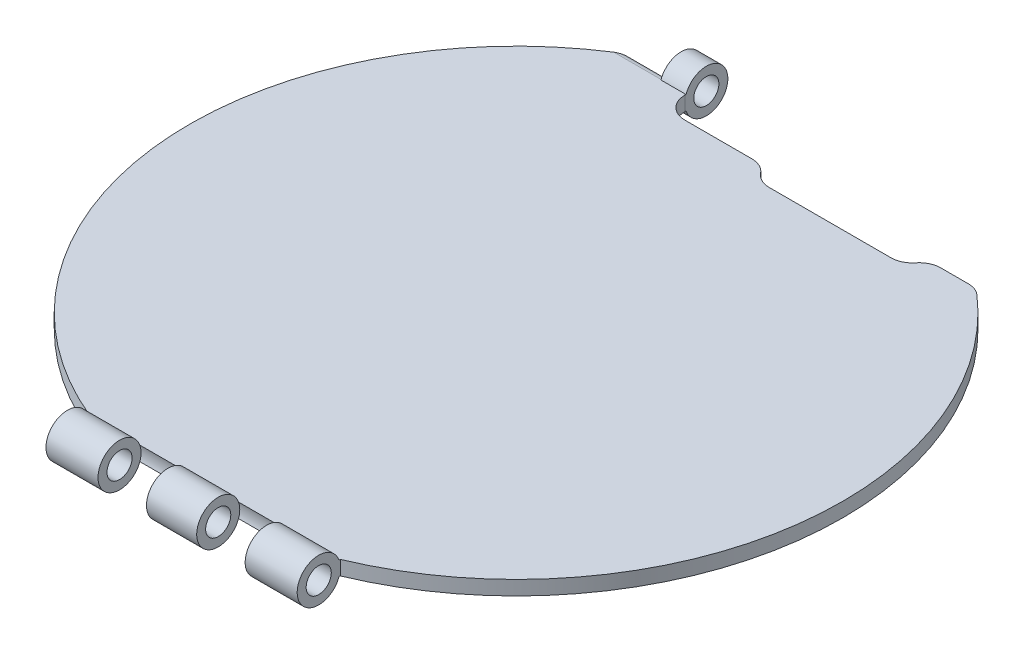
ISO-10303-21;
HEADER;
FILE_DESCRIPTION(('STEP AP214'),'2;1');
FILE_NAME('part.step','',(''),(''),'','','');
FILE_SCHEMA(('AUTOMOTIVE_DESIGN { 1 0 10303 214 1 1 1 1 }'));
ENDSEC;
DATA;
#1=APPLICATION_CONTEXT('core data for automotive mechanical design processes');
#2=APPLICATION_PROTOCOL_DEFINITION('international standard','automotive_design',2000,#1);
#3=PRODUCT_CONTEXT('',#1,'mechanical');
#4=PRODUCT('Part','Part','',(#3));
#5=PRODUCT_RELATED_PRODUCT_CATEGORY('part','',(#4));
#6=PRODUCT_DEFINITION_FORMATION('','',#4);
#7=PRODUCT_DEFINITION_CONTEXT('part definition',#1,'design');
#8=PRODUCT_DEFINITION('design','',#6,#7);
#9=PRODUCT_DEFINITION_SHAPE('','',#8);
#10=(LENGTH_UNIT() NAMED_UNIT(*) SI_UNIT(.MILLI.,.METRE.));
#11=(NAMED_UNIT(*) PLANE_ANGLE_UNIT() SI_UNIT($,.RADIAN.));
#12=(NAMED_UNIT(*) SI_UNIT($,.STERADIAN.) SOLID_ANGLE_UNIT());
#13=UNCERTAINTY_MEASURE_WITH_UNIT(LENGTH_MEASURE(1.E-05),#10,'distance_accuracy_value','');
#14=(GEOMETRIC_REPRESENTATION_CONTEXT(3) GLOBAL_UNCERTAINTY_ASSIGNED_CONTEXT((#13)) GLOBAL_UNIT_ASSIGNED_CONTEXT((#10,
#11,#12)) REPRESENTATION_CONTEXT('',''));
#15=CARTESIAN_POINT('',(0.,0.,0.));
#16=DIRECTION('',(0.,0.,1.));
#17=DIRECTION('',(1.,0.,0.));
#18=AXIS2_PLACEMENT_3D('',#15,#16,#17);
#19=CARTESIAN_POINT('',(0.,2.,0.));
#20=DIRECTION('',(0.,-1.,0.));
#21=DIRECTION('',(0.,0.,-1.));
#22=AXIS2_PLACEMENT_3D('',#19,#20,#21);
#23=CYLINDRICAL_SURFACE('',#22,45.5);
#24=CARTESIAN_POINT('',(-24.6411748908204,2.,-38.25));
#25=CARTESIAN_POINT('',(-24.5702066713157,1.9999596965377,-38.2957209822586));
#26=CARTESIAN_POINT('',(-24.4991004233827,1.99686219307155,-38.3412469119398));
#27=CARTESIAN_POINT('',(-24.3568712961138,1.98441752841852,-38.4317563325151));
#28=CARTESIAN_POINT('',(-24.2857487234497,1.97505665179361,-38.4767384119393));
#29=CARTESIAN_POINT('',(-24.1438681360292,1.9499147305259,-38.5659264625488));
#30=CARTESIAN_POINT('',(-24.0731116500243,1.93411619951037,-38.6101299750457));
#31=CARTESIAN_POINT('',(-23.9327724419009,1.89566379060061,-38.6972764785807));
#32=CARTESIAN_POINT('',(-23.8631884943603,1.87301760754939,-38.7402208254544));
#33=CARTESIAN_POINT('',(-23.7412863304989,1.82598395600054,-38.8150130246605));
#34=CARTESIAN_POINT('',(-23.6885871169038,1.80311862270403,-38.8471945950457));
#35=CARTESIAN_POINT('',(-23.5848844688285,1.75214798060038,-38.9102416038661));
#36=CARTESIAN_POINT('',(-23.5338817683363,1.72404043764821,-38.941106474228));
#37=CARTESIAN_POINT('',(-23.4341658463529,1.66151502465445,-39.0011959259099));
#38=CARTESIAN_POINT('',(-23.3854718098682,1.62705306651372,-39.0304070579719));
#39=CARTESIAN_POINT('',(-23.2924312087253,1.5507506700999,-39.0860020372196));
#40=CARTESIAN_POINT('',(-23.2480740121301,1.50892901781384,-39.1123928142101));
#41=CARTESIAN_POINT('',(-23.1842223688461,1.43636518669073,-39.1502563232632));
#42=CARTESIAN_POINT('',(-23.1622508446971,1.40861458957823,-39.1632569817898));
#43=CARTESIAN_POINT('',(-23.1215533504845,1.34996710160191,-39.187298020832));
#44=CARTESIAN_POINT('',(-23.1028290287479,1.31906862538794,-39.1983374058458));
#45=CARTESIAN_POINT('',(-23.0696094000881,1.25368193181552,-39.2178977094692));
#46=CARTESIAN_POINT('',(-23.0551778488515,1.21914901147023,-39.2263806826422));
#47=CARTESIAN_POINT('',(-23.032459919916,1.14749929485938,-39.2397243872318));
#48=CARTESIAN_POINT('',(-23.0241474788879,1.11039420277142,-39.2446004819811));
#49=CARTESIAN_POINT('',(-23.0179590110865,1.06070438376751,-39.2482300814179));
#50=CARTESIAN_POINT('',(-23.0168299882015,1.04860597417072,-39.24889218673));
#51=CARTESIAN_POINT('',(-23.0153210149208,1.02434077152753,-39.2497770634488));
#52=CARTESIAN_POINT('',(-23.0149414238582,1.01217394848103,-39.2499996241055));
#53=CARTESIAN_POINT('',(-23.0149407994024,1.,-39.25));
#54=B_SPLINE_CURVE_WITH_KNOTS('',3,(#24,#25,#26,#27,#28,#29,#30,#31,#32,#33,#34,#35,#36,#37,#38,
#39,#40,#41,#42,#43,#44,#45,#46,#47,#48,#49,#50,#51,#52,#53),.UNSPECIFIED.,.F.,.F.,(4,2,2,2,2,2,
2,2,2,2,2,2,2,2,4),(0.,0.253225039540916,0.507006410070499,0.761481762459574,1.01567221188443,
1.21301403842685,1.41044016185301,1.60929145910031,1.80764235227074,1.92051987675763,
2.03345453286204,2.14799115547731,2.26203706015327,2.29851956969637,2.33501956740273),.UNSPECIFIED.);
#55=CARTESIAN_POINT('',(-24.6411748908204,2.,-38.25));
#56=VERTEX_POINT('',#55);
#57=CARTESIAN_POINT('',(-23.0149407994025,1.,-39.25));
#58=VERTEX_POINT('',#57);
#59=EDGE_CURVE('E319',#56,#58,#54,.T.);
#60=ORIENTED_EDGE('',*,*,#59,.T.);
#61=CARTESIAN_POINT('',(-23.0149407994025,1.,-39.25));
#62=CARTESIAN_POINT('',(-23.0148741561854,0.969286374247809,-39.2500381029574));
#63=CARTESIAN_POINT('',(-23.0173506083669,0.938670834738426,-39.2485870040994));
#64=CARTESIAN_POINT('',(-23.0267773495654,0.878703515223693,-39.2430576492495));
#65=CARTESIAN_POINT('',(-23.0336796044553,0.849341734245978,-39.2390075998292));
#66=CARTESIAN_POINT('',(-23.0534506773032,0.785543459970374,-39.227395556553));
#67=CARTESIAN_POINT('',(-23.0673416138784,0.751539619162523,-39.2192312383603));
#68=CARTESIAN_POINT('',(-23.0996789658975,0.686492530136526,-39.2001937200962));
#69=CARTESIAN_POINT('',(-23.1181454065242,0.655463150812555,-39.1893086102947));
#70=CARTESIAN_POINT('',(-23.1694041537938,0.580381494304076,-39.1590347552254));
#71=CARTESIAN_POINT('',(-23.204507487013,0.538489594449746,-39.138251384443));
#72=CARTESIAN_POINT('',(-23.2795622345663,0.46126123896693,-39.0936555472977));
#73=CARTESIAN_POINT('',(-23.3195230888848,0.425937896527176,-39.0698371783195));
#74=CARTESIAN_POINT('',(-23.3986045766236,0.363934824047723,-39.0225220344956));
#75=CARTESIAN_POINT('',(-23.4374478269753,0.336753741337315,-38.9992075253694));
#76=CARTESIAN_POINT('',(-23.5169124763375,0.286326376104293,-38.9513412123591));
#77=CARTESIAN_POINT('',(-23.5575352761345,0.263083266067907,-38.9267884313736));
#78=CARTESIAN_POINT('',(-23.6401807002488,0.219999255825462,-38.8766536946393));
#79=CARTESIAN_POINT('',(-23.6822082197009,0.200172155820177,-38.8510680570094));
#80=CARTESIAN_POINT('',(-23.7671697414834,0.163675054679665,-38.7991510740309));
#81=CARTESIAN_POINT('',(-23.8101040085193,0.147005990030725,-38.7728195101374));
#82=CARTESIAN_POINT('',(-23.9180731895139,0.109015786788251,-38.7063501477313));
#83=CARTESIAN_POINT('',(-23.9835118596164,0.0894855517851305,-38.6658398273758));
#84=CARTESIAN_POINT('',(-24.1152736365107,0.0563191180665869,-38.583799872844));
#85=CARTESIAN_POINT('',(-24.1815972981735,0.0426868153106223,-38.5422695839931));
#86=CARTESIAN_POINT('',(-24.3134894159011,0.0212018499674159,-38.4592016154307));
#87=CARTESIAN_POINT('',(-24.3790502899437,0.0132505938023175,-38.4176772356259));
#88=CARTESIAN_POINT('',(-24.5101707316928,0.00266787056308723,-38.3341570604741));
#89=CARTESIAN_POINT('',(-24.5757301687682,2.88571409352804E-05,-38.2921620191881));
#90=CARTESIAN_POINT('',(-24.6411748908204,0.,-38.25));
#91=B_SPLINE_CURVE_WITH_KNOTS('',3,(#61,#62,#63,#64,#65,#66,#67,#68,#69,#70,#71,#72,#73,#74,#75,
#76,#77,#78,#79,#80,#81,#82,#83,#84,#85,#86,#87,#88,#89,#90),.UNSPECIFIED.,.F.,.F.,(4,2,2,2,2,2,
2,2,2,2,2,2,2,2,4),(0.,0.091848329399764,0.18271630544408,0.294976791301025,0.407737555132771,
0.582176478341645,0.756959990624091,0.9152284524779,1.073623817532,1.2326447922126,
1.39171284953949,1.6296448637312,1.86773380807495,2.10158318434543,2.33510012895495),.UNSPECIFIED.);
#92=CARTESIAN_POINT('',(-24.6411748908204,0.,-38.25));
#93=VERTEX_POINT('',#92);
#94=EDGE_CURVE('E327',#58,#93,#91,.T.);
#95=ORIENTED_EDGE('',*,*,#94,.T.);
#96=CARTESIAN_POINT('',(0.,0.,0.));
#97=DIRECTION('',(0.,1.,0.));
#98=DIRECTION('',(0.,0.,1.));
#99=AXIS2_PLACEMENT_3D('',#96,#97,#98);
#100=CIRCLE('',#99,45.5);
#101=CARTESIAN_POINT('',(-17.5,0.,42.));
#102=VERTEX_POINT('',#101);
#103=EDGE_CURVE('E296',#93,#102,#100,.T.);
#104=ORIENTED_EDGE('',*,*,#103,.T.);
#105=DIRECTION('',(0.,-1.,0.));
#106=VECTOR('',#105,1.);
#107=CARTESIAN_POINT('',(-17.5,2.,42.));
#108=LINE('',#107,#106);
#109=CARTESIAN_POINT('',(-17.5,2.,42.));
#110=VERTEX_POINT('',#109);
#111=EDGE_CURVE('E309',#110,#102,#108,.T.);
#112=ORIENTED_EDGE('',*,*,#111,.F.);
#113=CARTESIAN_POINT('',(0.,2.,0.));
#114=DIRECTION('',(0.,1.,0.));
#115=DIRECTION('',(0.,0.,1.));
#116=AXIS2_PLACEMENT_3D('',#113,#114,#115);
#117=CIRCLE('',#116,45.5);
#118=EDGE_CURVE('E298',#56,#110,#117,.T.);
#119=ORIENTED_EDGE('',*,*,#118,.F.);
#120=EDGE_LOOP('',(#60,#95,#104,#112,#119));
#121=FACE_BOUND('',#120,.T.);
#122=ADVANCED_FACE('F37',(#121),#23,.T.);
#123=CARTESIAN_POINT('',(17.5,1.,45.));
#124=DIRECTION('',(-1.,0.,0.));
#125=DIRECTION('',(0.,0.,1.));
#126=AXIS2_PLACEMENT_3D('',#123,#124,#125);
#127=CYLINDRICAL_SURFACE('',#126,3.);
#128=CARTESIAN_POINT('',(-3.5,1.,45.));
#129=DIRECTION('',(1.,0.,0.));
#130=DIRECTION('',(0.,0.,-1.));
#131=AXIS2_PLACEMENT_3D('',#128,#129,#130);
#132=CIRCLE('',#131,2.99999999999999);
#133=CARTESIAN_POINT('',(-3.5,2.,42.1715728752538));
#134=VERTEX_POINT('',#133);
#135=CARTESIAN_POINT('',(-3.5,0.,42.1715728752538));
#136=VERTEX_POINT('',#135);
#137=EDGE_CURVE('E245',#134,#136,#132,.T.);
#138=ORIENTED_EDGE('',*,*,#137,.T.);
#139=DIRECTION('',(-1.,0.,0.));
#140=VECTOR('',#139,1.);
#141=CARTESIAN_POINT('',(17.5,0.,42.1715728752538));
#142=LINE('',#141,#140);
#143=CARTESIAN_POINT('',(3.5,0.,42.1715728752538));
#144=VERTEX_POINT('',#143);
#145=EDGE_CURVE('E484',#144,#136,#142,.T.);
#146=ORIENTED_EDGE('',*,*,#145,.F.);
#147=CARTESIAN_POINT('',(3.5,1.,45.));
#148=DIRECTION('',(1.,0.,0.));
#149=DIRECTION('',(0.,0.,-1.));
#150=AXIS2_PLACEMENT_3D('',#147,#148,#149);
#151=CIRCLE('',#150,2.99999999999999);
#152=CARTESIAN_POINT('',(3.5,2.,42.1715728752538));
#153=VERTEX_POINT('',#152);
#154=EDGE_CURVE('E261',#153,#144,#151,.T.);
#155=ORIENTED_EDGE('',*,*,#154,.F.);
#156=DIRECTION('',(-1.,0.,0.));
#157=VECTOR('',#156,1.);
#158=CARTESIAN_POINT('',(17.5,2.,42.1715728752538));
#159=LINE('',#158,#157);
#160=EDGE_CURVE('E848',#153,#134,#159,.T.);
#161=ORIENTED_EDGE('',*,*,#160,.T.);
#162=EDGE_LOOP('',(#138,#146,#155,#161));
#163=FACE_BOUND('',#162,.T.);
#164=ADVANCED_FACE('F340',(#163),#127,.T.);
#165=CARTESIAN_POINT('',(17.5,1.,45.));
#166=DIRECTION('',(-1.,0.,0.));
#167=DIRECTION('',(0.,0.,1.));
#168=AXIS2_PLACEMENT_3D('',#165,#166,#167);
#169=CYLINDRICAL_SURFACE('',#168,1.75);
#170=CARTESIAN_POINT('',(3.5,1.,45.));
#171=DIRECTION('',(1.,0.,0.));
#172=DIRECTION('',(0.,0.,-1.));
#173=AXIS2_PLACEMENT_3D('',#170,#171,#172);
#174=CIRCLE('',#173,1.75);
#175=CARTESIAN_POINT('',(3.5,1.,43.25));
#176=VERTEX_POINT('',#175);
#177=EDGE_CURVE('E259',#176,#176,#174,.T.);
#178=ORIENTED_EDGE('',*,*,#177,.T.);
#179=EDGE_LOOP('',(#178));
#180=FACE_BOUND('',#179,.T.);
#181=CARTESIAN_POINT('',(-3.5,1.,45.));
#182=DIRECTION('',(-1.,0.,0.));
#183=DIRECTION('',(0.,0.,1.));
#184=AXIS2_PLACEMENT_3D('',#181,#182,#183);
#185=CIRCLE('',#184,1.75);
#186=CARTESIAN_POINT('',(-3.5,1.,46.75));
#187=VERTEX_POINT('',#186);
#188=EDGE_CURVE('E243',#187,#187,#185,.T.);
#189=ORIENTED_EDGE('',*,*,#188,.T.);
#190=EDGE_LOOP('',(#189));
#191=FACE_BOUND('',#190,.T.);
#192=ADVANCED_FACE('F560',(#180,#191),#169,.F.);
#193=CARTESIAN_POINT('',(-10.25,0.,42.1715728752538));
#194=VERTEX_POINT('',#193);
#195=CARTESIAN_POINT('',(-17.5,0.,42.1715728752538));
#196=VERTEX_POINT('',#195);
#197=EDGE_CURVE('E287',#194,#196,#142,.T.);
#198=ORIENTED_EDGE('',*,*,#197,.F.);
#199=CARTESIAN_POINT('',(-10.25,1.,45.));
#200=DIRECTION('',(1.,0.,0.));
#201=DIRECTION('',(0.,0.,-1.));
#202=AXIS2_PLACEMENT_3D('',#199,#200,#201);
#203=CIRCLE('',#202,2.99999999999999);
#204=CARTESIAN_POINT('',(-10.25,2.,42.1715728752538));
#205=VERTEX_POINT('',#204);
#206=EDGE_CURVE('E241',#205,#194,#203,.T.);
#207=ORIENTED_EDGE('',*,*,#206,.F.);
#208=CARTESIAN_POINT('',(-17.5,2.,42.1715728752538));
#209=VERTEX_POINT('',#208);
#210=EDGE_CURVE('E291',#205,#209,#159,.T.);
#211=ORIENTED_EDGE('',*,*,#210,.T.);
#212=CARTESIAN_POINT('',(-17.5,1.,45.));
#213=DIRECTION('',(1.,0.,0.));
#214=DIRECTION('',(0.,0.,-1.));
#215=AXIS2_PLACEMENT_3D('',#212,#213,#214);
#216=CIRCLE('',#215,3.);
#217=EDGE_CURVE('E271',#209,#196,#216,.T.);
#218=ORIENTED_EDGE('',*,*,#217,.T.);
#219=EDGE_LOOP('',(#198,#207,#211,#218));
#220=FACE_BOUND('',#219,.T.);
#221=ADVANCED_FACE('F493',(#220),#127,.T.);
#222=CARTESIAN_POINT('',(-10.25,1.,45.));
#223=DIRECTION('',(-1.,0.,0.));
#224=DIRECTION('',(0.,0.,1.));
#225=AXIS2_PLACEMENT_3D('',#222,#223,#224);
#226=CIRCLE('',#225,1.75);
#227=CARTESIAN_POINT('',(-10.25,1.,46.75));
#228=VERTEX_POINT('',#227);
#229=EDGE_CURVE('E250',#228,#228,#226,.T.);
#230=ORIENTED_EDGE('',*,*,#229,.F.);
#231=EDGE_LOOP('',(#230));
#232=FACE_BOUND('',#231,.T.);
#233=CARTESIAN_POINT('',(-17.5,1.,45.));
#234=DIRECTION('',(1.,0.,0.));
#235=DIRECTION('',(0.,0.,-1.));
#236=AXIS2_PLACEMENT_3D('',#233,#234,#235);
#237=CIRCLE('',#236,1.75);
#238=CARTESIAN_POINT('',(-17.5,1.,43.25));
#239=VERTEX_POINT('',#238);
#240=EDGE_CURVE('E264',#239,#239,#237,.T.);
#241=ORIENTED_EDGE('',*,*,#240,.F.);
#242=EDGE_LOOP('',(#241));
#243=FACE_BOUND('',#242,.T.);
#244=ADVANCED_FACE('F561',(#232,#243),#169,.F.);
#245=CARTESIAN_POINT('',(0.,2.,0.));
#246=DIRECTION('',(0.,-1.,0.));
#247=DIRECTION('',(0.,0.,-1.));
#248=AXIS2_PLACEMENT_3D('',#245,#246,#247);
#249=CYLINDRICAL_SURFACE('',#248,45.5);
#250=CARTESIAN_POINT('',(0.,0.,0.));
#251=DIRECTION('',(0.,1.,0.));
#252=DIRECTION('',(0.,0.,1.));
#253=AXIS2_PLACEMENT_3D('',#250,#251,#252);
#254=CIRCLE('',#253,45.5);
#255=CARTESIAN_POINT('',(17.5,0.,42.));
#256=VERTEX_POINT('',#255);
#257=CARTESIAN_POINT('',(29.9429960154394,0.,-34.2588235294118));
#258=VERTEX_POINT('',#257);
#259=EDGE_CURVE('E301',#256,#258,#254,.T.);
#260=ORIENTED_EDGE('',*,*,#259,.T.);
#261=DIRECTION('',(0.,-1.,0.));
#262=VECTOR('',#261,1.);
#263=CARTESIAN_POINT('',(29.9429960154394,2.,-34.2588235294118));
#264=LINE('',#263,#262);
#265=CARTESIAN_POINT('',(29.9429960154394,2.,-34.2588235294118));
#266=VERTEX_POINT('',#265);
#267=EDGE_CURVE('E374',#258,#266,#264,.F.);
#268=ORIENTED_EDGE('',*,*,#267,.T.);
#269=CARTESIAN_POINT('',(0.,2.,0.));
#270=DIRECTION('',(0.,1.,0.));
#271=DIRECTION('',(0.,0.,1.));
#272=AXIS2_PLACEMENT_3D('',#269,#270,#271);
#273=CIRCLE('',#272,45.5);
#274=CARTESIAN_POINT('',(17.5,2.,42.));
#275=VERTEX_POINT('',#274);
#276=EDGE_CURVE('E300',#275,#266,#273,.T.);
#277=ORIENTED_EDGE('',*,*,#276,.F.);
#278=DIRECTION('',(0.,-1.,0.));
#279=VECTOR('',#278,1.);
#280=CARTESIAN_POINT('',(17.5,2.,42.));
#281=LINE('',#280,#279);
#282=EDGE_CURVE('E304',#275,#256,#281,.T.);
#283=ORIENTED_EDGE('',*,*,#282,.T.);
#284=EDGE_LOOP('',(#260,#268,#277,#283));
#285=FACE_BOUND('',#284,.T.);
#286=ADVANCED_FACE('F342',(#285),#249,.T.);
#287=CARTESIAN_POINT('',(0.,2.,0.));
#288=DIRECTION('',(0.,1.,0.));
#289=DIRECTION('',(0.,0.,1.));
#290=AXIS2_PLACEMENT_3D('',#287,#288,#289);
#291=PLANE('',#290);
#292=ORIENTED_EDGE('',*,*,#276,.T.);
#293=CARTESIAN_POINT('',(27.968732541894,2.,-32.));
#294=DIRECTION('',(0.,1.,0.));
#295=DIRECTION('',(0.,0.,1.));
#296=AXIS2_PLACEMENT_3D('',#293,#294,#295);
#297=CIRCLE('',#296,3.);
#298=CARTESIAN_POINT('',(27.968732541894,2.,-35.));
#299=VERTEX_POINT('',#298);
#300=EDGE_CURVE('E385',#266,#299,#297,.T.);
#301=ORIENTED_EDGE('',*,*,#300,.T.);
#302=DIRECTION('',(1.,0.,0.));
#303=VECTOR('',#302,1.);
#304=CARTESIAN_POINT('',(20.25,2.,-35.));
#305=LINE('',#304,#303);
#306=CARTESIAN_POINT('',(24.1547375096555,2.,-35.));
#307=VERTEX_POINT('',#306);
#308=EDGE_CURVE('E510',#307,#299,#305,.T.);
#309=ORIENTED_EDGE('',*,*,#308,.F.);
#310=CARTESIAN_POINT('',(24.1547375096555,2.,-32.));
#311=DIRECTION('',(0.,1.,0.));
#312=DIRECTION('',(0.,0.,1.));
#313=AXIS2_PLACEMENT_3D('',#310,#311,#312);
#314=CIRCLE('',#313,3.);
#315=CARTESIAN_POINT('',(21.8128632602561,2.,-33.875));
#316=VERTEX_POINT('',#315);
#317=EDGE_CURVE('E382',#307,#316,#314,.T.);
#318=ORIENTED_EDGE('',*,*,#317,.T.);
#319=CARTESIAN_POINT('',(19.4709890108567,2.,-35.75));
#320=DIRECTION('',(0.,1.,0.));
#321=DIRECTION('',(0.,0.,1.));
#322=AXIS2_PLACEMENT_3D('',#319,#320,#321);
#323=CIRCLE('',#322,3.);
#324=CARTESIAN_POINT('',(19.4709890108567,2.,-32.75));
#325=VERTEX_POINT('',#324);
#326=EDGE_CURVE('E415',#316,#325,#323,.F.);
#327=ORIENTED_EDGE('',*,*,#326,.T.);
#328=DIRECTION('',(1.,0.,0.));
#329=VECTOR('',#328,1.);
#330=CARTESIAN_POINT('',(0.749999999999977,2.,-32.75));
#331=LINE('',#330,#329);
#332=CARTESIAN_POINT('',(2.52901098914321,2.,-32.75));
#333=VERTEX_POINT('',#332);
#334=EDGE_CURVE('E233',#333,#325,#331,.T.);
#335=ORIENTED_EDGE('',*,*,#334,.F.);
#336=CARTESIAN_POINT('',(2.52901098914321,2.,-35.75));
#337=DIRECTION('',(0.,1.,0.));
#338=DIRECTION('',(0.,0.,1.));
#339=AXIS2_PLACEMENT_3D('',#336,#337,#338);
#340=CIRCLE('',#339,3.);
#341=CARTESIAN_POINT('',(0.187136739743814,2.,-33.875));
#342=VERTEX_POINT('',#341);
#343=EDGE_CURVE('E45',#333,#342,#340,.F.);
#344=ORIENTED_EDGE('',*,*,#343,.T.);
#345=CARTESIAN_POINT('',(-2.15473750965558,2.,-32.));
#346=DIRECTION('',(0.,1.,0.));
#347=DIRECTION('',(0.,0.,1.));
#348=AXIS2_PLACEMENT_3D('',#345,#346,#347);
#349=CIRCLE('',#348,3.);
#350=CARTESIAN_POINT('',(-2.15473750965558,2.,-35.));
#351=VERTEX_POINT('',#350);
#352=EDGE_CURVE('E380',#342,#351,#349,.T.);
#353=ORIENTED_EDGE('',*,*,#352,.T.);
#354=DIRECTION('',(1.,0.,0.));
#355=VECTOR('',#354,1.);
#356=CARTESIAN_POINT('',(0.749999999999978,2.,-35.));
#357=LINE('',#356,#355);
#358=CARTESIAN_POINT('',(-11.5,2.,-35.));
#359=VERTEX_POINT('',#358);
#360=EDGE_CURVE('E228',#359,#351,#357,.T.);
#361=ORIENTED_EDGE('',*,*,#360,.F.);
#362=CARTESIAN_POINT('',(-11.5,2.,-38.));
#363=DIRECTION('',(0.,1.,0.));
#364=DIRECTION('',(0.,0.,1.));
#365=AXIS2_PLACEMENT_3D('',#362,#363,#364);
#366=CIRCLE('',#365,3.);
#367=CARTESIAN_POINT('',(-14.5,2.,-38.));
#368=VERTEX_POINT('',#367);
#369=EDGE_CURVE('E404',#359,#368,#366,.F.);
#370=ORIENTED_EDGE('',*,*,#369,.T.);
#371=DIRECTION('',(0.,0.,1.));
#372=VECTOR('',#371,1.);
#373=CARTESIAN_POINT('',(-14.5,2.,-35.));
#374=LINE('',#373,#372);
#375=CARTESIAN_POINT('',(-14.5,2.,-38.1715728752538));
#376=VERTEX_POINT('',#375);
#377=EDGE_CURVE('E218',#376,#368,#374,.T.);
#378=ORIENTED_EDGE('',*,*,#377,.F.);
#379=DIRECTION('',(1.,0.,0.));
#380=VECTOR('',#379,1.);
#381=CARTESIAN_POINT('',(-18.,2.,-38.1715728752538));
#382=LINE('',#381,#380);
#383=CARTESIAN_POINT('',(-18.,2.,-38.1715728752538));
#384=VERTEX_POINT('',#383);
#385=EDGE_CURVE('E214',#384,#376,#382,.T.);
#386=ORIENTED_EDGE('',*,*,#385,.F.);
#387=DIRECTION('',(0.,0.,-1.));
#388=VECTOR('',#387,1.);
#389=CARTESIAN_POINT('',(-18.,2.,0.));
#390=LINE('',#389,#388);
#391=CARTESIAN_POINT('',(-18.,2.,-38.25));
#392=VERTEX_POINT('',#391);
#393=EDGE_CURVE('E224',#384,#392,#390,.T.);
#394=ORIENTED_EDGE('',*,*,#393,.T.);
#395=DIRECTION('',(-1.,0.,0.));
#396=VECTOR('',#395,1.);
#397=CARTESIAN_POINT('',(-22.471115554285,2.,-38.25));
#398=LINE('',#397,#396);
#399=EDGE_CURVE('E365',#392,#56,#398,.T.);
#400=ORIENTED_EDGE('',*,*,#399,.T.);
#401=ORIENTED_EDGE('',*,*,#118,.T.);
#402=DIRECTION('',(0.,0.,1.));
#403=VECTOR('',#402,1.);
#404=CARTESIAN_POINT('',(-17.5,2.,42.));
#405=LINE('',#404,#403);
#406=EDGE_CURVE('E267',#110,#209,#405,.T.);
#407=ORIENTED_EDGE('',*,*,#406,.T.);
#408=ORIENTED_EDGE('',*,*,#210,.F.);
#409=DIRECTION('',(1.,0.,0.));
#410=VECTOR('',#409,1.);
#411=CARTESIAN_POINT('',(-10.25,2.,42.1715728752538));
#412=LINE('',#411,#410);
#413=EDGE_CURVE('E253',#134,#205,#412,.F.);
#414=ORIENTED_EDGE('',*,*,#413,.F.);
#415=ORIENTED_EDGE('',*,*,#160,.F.);
#416=CARTESIAN_POINT('',(10.25,2.,42.1715728752538));
#417=VERTEX_POINT('',#416);
#418=EDGE_CURVE('E297',#417,#153,#159,.T.);
#419=ORIENTED_EDGE('',*,*,#418,.F.);
#420=CARTESIAN_POINT('',(17.5,2.,42.1715728752538));
#421=VERTEX_POINT('',#420);
#422=EDGE_CURVE('E293',#421,#417,#159,.T.);
#423=ORIENTED_EDGE('',*,*,#422,.F.);
#424=DIRECTION('',(0.,0.,1.));
#425=VECTOR('',#424,1.);
#426=CARTESIAN_POINT('',(17.5,2.,42.));
#427=LINE('',#426,#425);
#428=EDGE_CURVE('E280',#275,#421,#427,.T.);
#429=ORIENTED_EDGE('',*,*,#428,.F.);
#430=EDGE_LOOP('',(#292,#301,#309,#318,#327,#335,#344,#353,#361,#370,#378,#386,#394,#400,#401,
#407,#408,#414,#415,#419,#423,#429));
#431=FACE_BOUND('',#430,.T.);
#432=ADVANCED_FACE('F430',(#431),#291,.T.);
#433=CARTESIAN_POINT('',(0.,0.,0.));
#434=DIRECTION('',(0.,1.,0.));
#435=DIRECTION('',(0.,0.,1.));
#436=AXIS2_PLACEMENT_3D('',#433,#434,#435);
#437=PLANE('',#436);
#438=DIRECTION('',(-1.,0.,0.));
#439=VECTOR('',#438,1.);
#440=CARTESIAN_POINT('',(20.25,0.,-35.));
#441=LINE('',#440,#439);
#442=CARTESIAN_POINT('',(27.968732541894,0.,-35.));
#443=VERTEX_POINT('',#442);
#444=CARTESIAN_POINT('',(24.1547375096555,0.,-35.));
#445=VERTEX_POINT('',#444);
#446=EDGE_CURVE('E377',#443,#445,#441,.T.);
#447=ORIENTED_EDGE('',*,*,#446,.F.);
#448=CARTESIAN_POINT('',(27.968732541894,0.,-32.));
#449=DIRECTION('',(0.,1.,0.));
#450=DIRECTION('',(0.,0.,1.));
#451=AXIS2_PLACEMENT_3D('',#448,#449,#450);
#452=CIRCLE('',#451,3.);
#453=EDGE_CURVE('E395',#443,#258,#452,.F.);
#454=ORIENTED_EDGE('',*,*,#453,.T.);
#455=ORIENTED_EDGE('',*,*,#259,.F.);
#456=DIRECTION('',(0.,0.,-1.));
#457=VECTOR('',#456,1.);
#458=CARTESIAN_POINT('',(17.5,0.,42.));
#459=LINE('',#458,#457);
#460=CARTESIAN_POINT('',(17.5,0.,42.1715728752538));
#461=VERTEX_POINT('',#460);
#462=EDGE_CURVE('E284',#461,#256,#459,.T.);
#463=ORIENTED_EDGE('',*,*,#462,.F.);
#464=CARTESIAN_POINT('',(10.25,0.,42.1715728752538));
#465=VERTEX_POINT('',#464);
#466=EDGE_CURVE('E288',#461,#465,#142,.T.);
#467=ORIENTED_EDGE('',*,*,#466,.T.);
#468=EDGE_CURVE('E292',#465,#144,#142,.T.);
#469=ORIENTED_EDGE('',*,*,#468,.T.);
#470=ORIENTED_EDGE('',*,*,#145,.T.);
#471=EDGE_CURVE('E487',#136,#194,#142,.T.);
#472=ORIENTED_EDGE('',*,*,#471,.T.);
#473=ORIENTED_EDGE('',*,*,#197,.T.);
#474=DIRECTION('',(0.,0.,-1.));
#475=VECTOR('',#474,1.);
#476=CARTESIAN_POINT('',(-17.5,0.,42.));
#477=LINE('',#476,#475);
#478=EDGE_CURVE('E274',#196,#102,#477,.T.);
#479=ORIENTED_EDGE('',*,*,#478,.T.);
#480=ORIENTED_EDGE('',*,*,#103,.F.);
#481=DIRECTION('',(1.,0.,0.));
#482=VECTOR('',#481,1.);
#483=CARTESIAN_POINT('',(0.,0.,-38.25));
#484=LINE('',#483,#482);
#485=CARTESIAN_POINT('',(-18.,0.,-38.25));
#486=VERTEX_POINT('',#485);
#487=EDGE_CURVE('E317',#93,#486,#484,.T.);
#488=ORIENTED_EDGE('',*,*,#487,.T.);
#489=DIRECTION('',(0.,0.,-1.));
#490=VECTOR('',#489,1.);
#491=CARTESIAN_POINT('',(-18.,0.,0.));
#492=LINE('',#491,#490);
#493=CARTESIAN_POINT('',(-18.,0.,-38.1715728752538));
#494=VERTEX_POINT('',#493);
#495=EDGE_CURVE('E210',#494,#486,#492,.T.);
#496=ORIENTED_EDGE('',*,*,#495,.F.);
#497=DIRECTION('',(1.,0.,0.));
#498=VECTOR('',#497,1.);
#499=CARTESIAN_POINT('',(-18.,0.,-38.1715728752538));
#500=LINE('',#499,#498);
#501=CARTESIAN_POINT('',(-14.5,0.,-38.1715728752538));
#502=VERTEX_POINT('',#501);
#503=EDGE_CURVE('E205',#494,#502,#500,.T.);
#504=ORIENTED_EDGE('',*,*,#503,.T.);
#505=DIRECTION('',(0.,0.,-1.));
#506=VECTOR('',#505,1.);
#507=CARTESIAN_POINT('',(-14.5,0.,-35.));
#508=LINE('',#507,#506);
#509=CARTESIAN_POINT('',(-14.5,0.,-38.));
#510=VERTEX_POINT('',#509);
#511=EDGE_CURVE('E192',#510,#502,#508,.T.);
#512=ORIENTED_EDGE('',*,*,#511,.F.);
#513=CARTESIAN_POINT('',(-11.5,0.,-38.));
#514=DIRECTION('',(0.,1.,0.));
#515=DIRECTION('',(0.,0.,1.));
#516=AXIS2_PLACEMENT_3D('',#513,#514,#515);
#517=CIRCLE('',#516,3.);
#518=CARTESIAN_POINT('',(-11.5,0.,-35.));
#519=VERTEX_POINT('',#518);
#520=EDGE_CURVE('E402',#510,#519,#517,.T.);
#521=ORIENTED_EDGE('',*,*,#520,.T.);
#522=DIRECTION('',(-1.,0.,0.));
#523=VECTOR('',#522,1.);
#524=CARTESIAN_POINT('',(0.749999999999978,0.,-35.));
#525=LINE('',#524,#523);
#526=CARTESIAN_POINT('',(-2.15473750965558,0.,-35.));
#527=VERTEX_POINT('',#526);
#528=EDGE_CURVE('E229',#527,#519,#525,.T.);
#529=ORIENTED_EDGE('',*,*,#528,.F.);
#530=CARTESIAN_POINT('',(-2.15473750965558,0.,-32.));
#531=DIRECTION('',(0.,1.,0.));
#532=DIRECTION('',(0.,0.,1.));
#533=AXIS2_PLACEMENT_3D('',#530,#531,#532);
#534=CIRCLE('',#533,3.);
#535=CARTESIAN_POINT('',(0.187136739743814,0.,-33.875));
#536=VERTEX_POINT('',#535);
#537=EDGE_CURVE('E391',#527,#536,#534,.F.);
#538=ORIENTED_EDGE('',*,*,#537,.T.);
#539=CARTESIAN_POINT('',(2.52901098914321,0.,-35.75));
#540=DIRECTION('',(0.,1.,0.));
#541=DIRECTION('',(0.,0.,1.));
#542=AXIS2_PLACEMENT_3D('',#539,#540,#541);
#543=CIRCLE('',#542,3.);
#544=CARTESIAN_POINT('',(2.52901098914321,0.,-32.75));
#545=VERTEX_POINT('',#544);
#546=EDGE_CURVE('E11',#536,#545,#543,.T.);
#547=ORIENTED_EDGE('',*,*,#546,.T.);
#548=DIRECTION('',(-1.,0.,0.));
#549=VECTOR('',#548,1.);
#550=CARTESIAN_POINT('',(0.749999999999977,0.,-32.75));
#551=LINE('',#550,#549);
#552=CARTESIAN_POINT('',(19.4709890108567,0.,-32.75));
#553=VERTEX_POINT('',#552);
#554=EDGE_CURVE('E232',#553,#545,#551,.T.);
#555=ORIENTED_EDGE('',*,*,#554,.F.);
#556=CARTESIAN_POINT('',(19.4709890108567,0.,-35.75));
#557=DIRECTION('',(0.,1.,0.));
#558=DIRECTION('',(0.,0.,1.));
#559=AXIS2_PLACEMENT_3D('',#556,#557,#558);
#560=CIRCLE('',#559,3.);
#561=CARTESIAN_POINT('',(21.8128632602561,0.,-33.875));
#562=VERTEX_POINT('',#561);
#563=EDGE_CURVE('E417',#553,#562,#560,.T.);
#564=ORIENTED_EDGE('',*,*,#563,.T.);
#565=CARTESIAN_POINT('',(24.1547375096555,0.,-32.));
#566=DIRECTION('',(0.,1.,0.));
#567=DIRECTION('',(0.,0.,1.));
#568=AXIS2_PLACEMENT_3D('',#565,#566,#567);
#569=CIRCLE('',#568,3.);
#570=EDGE_CURVE('E393',#562,#445,#569,.F.);
#571=ORIENTED_EDGE('',*,*,#570,.T.);
#572=EDGE_LOOP('',(#447,#454,#455,#463,#467,#469,#470,#472,#473,#479,#480,#488,#496,#504,#512,
#521,#529,#538,#547,#555,#564,#571));
#573=FACE_BOUND('',#572,.T.);
#574=ADVANCED_FACE('F207',(#573),#437,.F.);
#575=CARTESIAN_POINT('',(17.5,1.,45.));
#576=DIRECTION('',(1.,0.,0.));
#577=DIRECTION('',(0.,0.,-1.));
#578=AXIS2_PLACEMENT_3D('',#575,#576,#577);
#579=PLANE('',#578);
#580=ORIENTED_EDGE('',*,*,#282,.F.);
#581=ORIENTED_EDGE('',*,*,#428,.T.);
#582=CARTESIAN_POINT('',(17.5,1.,45.));
#583=DIRECTION('',(1.,0.,0.));
#584=DIRECTION('',(0.,0.,-1.));
#585=AXIS2_PLACEMENT_3D('',#582,#583,#584);
#586=CIRCLE('',#585,3.);
#587=EDGE_CURVE('E282',#421,#461,#586,.T.);
#588=ORIENTED_EDGE('',*,*,#587,.T.);
#589=ORIENTED_EDGE('',*,*,#462,.T.);
#590=EDGE_LOOP('',(#580,#581,#588,#589));
#591=FACE_BOUND('',#590,.T.);
#592=CARTESIAN_POINT('',(17.5,1.,45.));
#593=DIRECTION('',(1.,0.,0.));
#594=DIRECTION('',(0.,0.,-1.));
#595=AXIS2_PLACEMENT_3D('',#592,#593,#594);
#596=CIRCLE('',#595,1.75);
#597=CARTESIAN_POINT('',(17.5,1.,43.25));
#598=VERTEX_POINT('',#597);
#599=EDGE_CURVE('E277',#598,#598,#596,.T.);
#600=ORIENTED_EDGE('',*,*,#599,.F.);
#601=EDGE_LOOP('',(#600));
#602=FACE_BOUND('',#601,.T.);
#603=ADVANCED_FACE('F469',(#591,#602),#579,.T.);
#604=ORIENTED_EDGE('',*,*,#422,.T.);
#605=CARTESIAN_POINT('',(10.25,1.,45.));
#606=DIRECTION('',(1.,0.,0.));
#607=DIRECTION('',(0.,0.,-1.));
#608=AXIS2_PLACEMENT_3D('',#605,#606,#607);
#609=CIRCLE('',#608,2.99999999999999);
#610=EDGE_CURVE('E256',#417,#465,#609,.T.);
#611=ORIENTED_EDGE('',*,*,#610,.T.);
#612=ORIENTED_EDGE('',*,*,#466,.F.);
#613=ORIENTED_EDGE('',*,*,#587,.F.);
#614=EDGE_LOOP('',(#604,#611,#612,#613));
#615=FACE_BOUND('',#614,.T.);
#616=ADVANCED_FACE('F478',(#615),#127,.T.);
#617=CARTESIAN_POINT('',(10.25,1.,45.));
#618=DIRECTION('',(1.,0.,0.));
#619=DIRECTION('',(0.,0.,-1.));
#620=AXIS2_PLACEMENT_3D('',#617,#618,#619);
#621=CIRCLE('',#620,1.75);
#622=CARTESIAN_POINT('',(10.25,1.,43.25));
#623=VERTEX_POINT('',#622);
#624=EDGE_CURVE('E268',#623,#623,#621,.T.);
#625=ORIENTED_EDGE('',*,*,#624,.F.);
#626=EDGE_LOOP('',(#625));
#627=FACE_BOUND('',#626,.T.);
#628=ORIENTED_EDGE('',*,*,#599,.T.);
#629=EDGE_LOOP('',(#628));
#630=FACE_BOUND('',#629,.T.);
#631=ADVANCED_FACE('F555',(#627,#630),#169,.F.);
#632=CARTESIAN_POINT('',(-17.5,1.,45.));
#633=DIRECTION('',(1.,0.,0.));
#634=DIRECTION('',(0.,0.,-1.));
#635=AXIS2_PLACEMENT_3D('',#632,#633,#634);
#636=PLANE('',#635);
#637=ORIENTED_EDGE('',*,*,#240,.T.);
#638=EDGE_LOOP('',(#637));
#639=FACE_BOUND('',#638,.T.);
#640=ORIENTED_EDGE('',*,*,#111,.T.);
#641=ORIENTED_EDGE('',*,*,#478,.F.);
#642=ORIENTED_EDGE('',*,*,#217,.F.);
#643=ORIENTED_EDGE('',*,*,#406,.F.);
#644=EDGE_LOOP('',(#640,#641,#642,#643));
#645=FACE_BOUND('',#644,.T.);
#646=ADVANCED_FACE('F497',(#639,#645),#636,.F.);
#647=CARTESIAN_POINT('',(10.25,1.,45.));
#648=DIRECTION('',(-1.,0.,0.));
#649=DIRECTION('',(0.,0.,1.));
#650=AXIS2_PLACEMENT_3D('',#647,#648,#649);
#651=CYLINDRICAL_SURFACE('',#650,2.99999999999999);
#652=EDGE_CURVE('E255',#144,#153,#151,.T.);
#653=ORIENTED_EDGE('',*,*,#652,.F.);
#654=ORIENTED_EDGE('',*,*,#468,.F.);
#655=EDGE_CURVE('E260',#465,#417,#609,.T.);
#656=ORIENTED_EDGE('',*,*,#655,.T.);
#657=ORIENTED_EDGE('',*,*,#418,.T.);
#658=EDGE_LOOP('',(#653,#654,#656,#657));
#659=FACE_BOUND('',#658,.T.);
#660=ADVANCED_FACE('F546',(#659),#651,.F.);
#661=CARTESIAN_POINT('',(10.25,1.,45.));
#662=DIRECTION('',(1.,0.,0.));
#663=DIRECTION('',(0.,0.,-1.));
#664=AXIS2_PLACEMENT_3D('',#661,#662,#663);
#665=PLANE('',#664);
#666=ORIENTED_EDGE('',*,*,#624,.T.);
#667=EDGE_LOOP('',(#666));
#668=FACE_BOUND('',#667,.T.);
#669=ORIENTED_EDGE('',*,*,#610,.F.);
#670=ORIENTED_EDGE('',*,*,#655,.F.);
#671=EDGE_LOOP('',(#669,#670));
#672=FACE_BOUND('',#671,.T.);
#673=ADVANCED_FACE('F543',(#668,#672),#665,.F.);
#674=CARTESIAN_POINT('',(3.5,1.,45.));
#675=DIRECTION('',(1.,0.,0.));
#676=DIRECTION('',(0.,0.,-1.));
#677=AXIS2_PLACEMENT_3D('',#674,#675,#676);
#678=PLANE('',#677);
#679=ORIENTED_EDGE('',*,*,#177,.F.);
#680=EDGE_LOOP('',(#679));
#681=FACE_BOUND('',#680,.T.);
#682=ORIENTED_EDGE('',*,*,#154,.T.);
#683=ORIENTED_EDGE('',*,*,#652,.T.);
#684=EDGE_LOOP('',(#682,#683));
#685=FACE_BOUND('',#684,.T.);
#686=ADVANCED_FACE('F541',(#681,#685),#678,.T.);
#687=CARTESIAN_POINT('',(-10.25,1.,45.));
#688=DIRECTION('',(1.,0.,0.));
#689=DIRECTION('',(0.,0.,-1.));
#690=AXIS2_PLACEMENT_3D('',#687,#688,#689);
#691=CYLINDRICAL_SURFACE('',#690,2.99999999999999);
#692=ORIENTED_EDGE('',*,*,#413,.T.);
#693=EDGE_CURVE('E244',#194,#205,#203,.T.);
#694=ORIENTED_EDGE('',*,*,#693,.F.);
#695=ORIENTED_EDGE('',*,*,#471,.F.);
#696=EDGE_CURVE('E236',#136,#134,#132,.T.);
#697=ORIENTED_EDGE('',*,*,#696,.T.);
#698=EDGE_LOOP('',(#692,#694,#695,#697));
#699=FACE_BOUND('',#698,.T.);
#700=ADVANCED_FACE('F534',(#699),#691,.F.);
#701=CARTESIAN_POINT('',(-10.25,1.,45.));
#702=DIRECTION('',(-1.,0.,0.));
#703=DIRECTION('',(0.,0.,-1.));
#704=AXIS2_PLACEMENT_3D('',#701,#702,#703);
#705=PLANE('',#704);
#706=ORIENTED_EDGE('',*,*,#229,.T.);
#707=EDGE_LOOP('',(#706));
#708=FACE_BOUND('',#707,.T.);
#709=ORIENTED_EDGE('',*,*,#206,.T.);
#710=ORIENTED_EDGE('',*,*,#693,.T.);
#711=EDGE_LOOP('',(#709,#710));
#712=FACE_BOUND('',#711,.T.);
#713=ADVANCED_FACE('F531',(#708,#712),#705,.F.);
#714=CARTESIAN_POINT('',(-3.5,1.,45.));
#715=DIRECTION('',(-1.,0.,0.));
#716=DIRECTION('',(0.,0.,-1.));
#717=AXIS2_PLACEMENT_3D('',#714,#715,#716);
#718=PLANE('',#717);
#719=ORIENTED_EDGE('',*,*,#188,.F.);
#720=EDGE_LOOP('',(#719));
#721=FACE_BOUND('',#720,.T.);
#722=ORIENTED_EDGE('',*,*,#137,.F.);
#723=ORIENTED_EDGE('',*,*,#696,.F.);
#724=EDGE_LOOP('',(#722,#723));
#725=FACE_BOUND('',#724,.T.);
#726=ADVANCED_FACE('F528',(#721,#725),#718,.T.);
#727=CARTESIAN_POINT('',(0.749999999999977,-39.8387374297931,-32.75));
#728=DIRECTION('',(0.,0.,1.));
#729=DIRECTION('',(1.,0.,0.));
#730=AXIS2_PLACEMENT_3D('',#727,#728,#729);
#731=PLANE('',#730);
#732=ORIENTED_EDGE('',*,*,#334,.T.);
#733=DIRECTION('',(0.,-1.,0.));
#734=VECTOR('',#733,1.);
#735=CARTESIAN_POINT('',(19.4709890108567,-39.8387374297931,-32.75));
#736=LINE('',#735,#734);
#737=EDGE_CURVE('E412',#325,#553,#736,.T.);
#738=ORIENTED_EDGE('',*,*,#737,.T.);
#739=ORIENTED_EDGE('',*,*,#554,.T.);
#740=DIRECTION('',(0.,1.,0.));
#741=VECTOR('',#740,1.);
#742=CARTESIAN_POINT('',(2.52901098914321,-39.8387374297931,-32.75));
#743=LINE('',#742,#741);
#744=EDGE_CURVE('E409',#545,#333,#743,.T.);
#745=ORIENTED_EDGE('',*,*,#744,.T.);
#746=EDGE_LOOP('',(#732,#738,#739,#745));
#747=FACE_BOUND('',#746,.T.);
#748=ADVANCED_FACE('F433',(#747),#731,.F.);
#749=CARTESIAN_POINT('',(0.749999999999978,-39.8387374297931,-35.));
#750=DIRECTION('',(0.,0.,1.));
#751=DIRECTION('',(1.,0.,0.));
#752=AXIS2_PLACEMENT_3D('',#749,#750,#751);
#753=PLANE('',#752);
#754=ORIENTED_EDGE('',*,*,#360,.T.);
#755=DIRECTION('',(0.,1.,0.));
#756=VECTOR('',#755,1.);
#757=CARTESIAN_POINT('',(-2.15473750965558,-39.8387374297931,-35.));
#758=LINE('',#757,#756);
#759=EDGE_CURVE('E399',#351,#527,#758,.F.);
#760=ORIENTED_EDGE('',*,*,#759,.T.);
#761=ORIENTED_EDGE('',*,*,#528,.T.);
#762=DIRECTION('',(0.,-1.,0.));
#763=VECTOR('',#762,1.);
#764=CARTESIAN_POINT('',(-11.5,-39.8387374297931,-35.));
#765=LINE('',#764,#763);
#766=EDGE_CURVE('E397',#519,#359,#765,.F.);
#767=ORIENTED_EDGE('',*,*,#766,.T.);
#768=EDGE_LOOP('',(#754,#760,#761,#767));
#769=FACE_BOUND('',#768,.T.);
#770=ADVANCED_FACE('F441',(#769),#753,.F.);
#771=CARTESIAN_POINT('',(-18.,1.,-41.));
#772=DIRECTION('',(1.,0.,0.));
#773=DIRECTION('',(0.,0.,-1.));
#774=AXIS2_PLACEMENT_3D('',#771,#772,#773);
#775=CYLINDRICAL_SURFACE('',#774,3.);
#776=ORIENTED_EDGE('',*,*,#385,.T.);
#777=CARTESIAN_POINT('',(-14.5,1.,-41.));
#778=DIRECTION('',(1.,0.,0.));
#779=DIRECTION('',(0.,0.,-1.));
#780=AXIS2_PLACEMENT_3D('',#777,#778,#779);
#781=CIRCLE('',#780,3.);
#782=EDGE_CURVE('E197',#502,#376,#781,.T.);
#783=ORIENTED_EDGE('',*,*,#782,.F.);
#784=ORIENTED_EDGE('',*,*,#503,.F.);
#785=CARTESIAN_POINT('',(-18.,1.,-41.));
#786=DIRECTION('',(1.,0.,0.));
#787=DIRECTION('',(0.,0.,-1.));
#788=AXIS2_PLACEMENT_3D('',#785,#786,#787);
#789=CIRCLE('',#788,3.);
#790=EDGE_CURVE('E215',#494,#384,#789,.T.);
#791=ORIENTED_EDGE('',*,*,#790,.T.);
#792=EDGE_LOOP('',(#776,#783,#784,#791));
#793=FACE_BOUND('',#792,.T.);
#794=ADVANCED_FACE('F217',(#793),#775,.T.);
#795=CARTESIAN_POINT('',(-18.,1.,-41.));
#796=DIRECTION('',(1.,0.,0.));
#797=DIRECTION('',(0.,0.,-1.));
#798=AXIS2_PLACEMENT_3D('',#795,#796,#797);
#799=PLANE('',#798);
#800=ORIENTED_EDGE('',*,*,#495,.T.);
#801=CARTESIAN_POINT('',(-18.,1.,-38.25));
#802=DIRECTION('',(1.,0.,0.));
#803=DIRECTION('',(0.,0.,-1.));
#804=AXIS2_PLACEMENT_3D('',#801,#802,#803);
#805=CIRCLE('',#804,1.);
#806=CARTESIAN_POINT('',(-18.,1.,-39.25));
#807=VERTEX_POINT('',#806);
#808=EDGE_CURVE('E366',#486,#807,#805,.T.);
#809=ORIENTED_EDGE('',*,*,#808,.T.);
#810=CARTESIAN_POINT('',(-18.,1.,-41.));
#811=DIRECTION('',(1.,0.,0.));
#812=DIRECTION('',(0.,0.,-1.));
#813=AXIS2_PLACEMENT_3D('',#810,#811,#812);
#814=CIRCLE('',#813,1.75);
#815=EDGE_CURVE('E202',#807,#807,#814,.T.);
#816=ORIENTED_EDGE('',*,*,#815,.T.);
#817=CARTESIAN_POINT('',(-18.,1.,-38.25));
#818=DIRECTION('',(1.,0.,0.));
#819=DIRECTION('',(0.,0.,-1.));
#820=AXIS2_PLACEMENT_3D('',#817,#818,#819);
#821=CIRCLE('',#820,1.);
#822=EDGE_CURVE('E370',#807,#392,#821,.T.);
#823=ORIENTED_EDGE('',*,*,#822,.T.);
#824=ORIENTED_EDGE('',*,*,#393,.F.);
#825=ORIENTED_EDGE('',*,*,#790,.F.);
#826=EDGE_LOOP('',(#800,#809,#816,#823,#824,#825));
#827=FACE_BOUND('',#826,.T.);
#828=ADVANCED_FACE('F501',(#827),#799,.F.);
#829=CARTESIAN_POINT('',(-14.5,1.,-41.));
#830=DIRECTION('',(1.,0.,0.));
#831=DIRECTION('',(0.,0.,-1.));
#832=AXIS2_PLACEMENT_3D('',#829,#830,#831);
#833=PLANE('',#832);
#834=CARTESIAN_POINT('',(-14.5,1.,-41.));
#835=DIRECTION('',(1.,0.,0.));
#836=DIRECTION('',(0.,0.,-1.));
#837=AXIS2_PLACEMENT_3D('',#834,#835,#836);
#838=CIRCLE('',#837,1.75);
#839=CARTESIAN_POINT('',(-14.5,1.,-42.75));
#840=VERTEX_POINT('',#839);
#841=EDGE_CURVE('E376',#840,#840,#838,.T.);
#842=ORIENTED_EDGE('',*,*,#841,.F.);
#843=EDGE_LOOP('',(#842));
#844=FACE_BOUND('',#843,.T.);
#845=ORIENTED_EDGE('',*,*,#377,.T.);
#846=DIRECTION('',(0.,-1.,0.));
#847=VECTOR('',#846,1.);
#848=CARTESIAN_POINT('',(-14.5,1.,-38.));
#849=LINE('',#848,#847);
#850=EDGE_CURVE('E200',#368,#510,#849,.T.);
#851=ORIENTED_EDGE('',*,*,#850,.T.);
#852=ORIENTED_EDGE('',*,*,#511,.T.);
#853=ORIENTED_EDGE('',*,*,#782,.T.);
#854=EDGE_LOOP('',(#845,#851,#852,#853));
#855=FACE_BOUND('',#854,.T.);
#856=ADVANCED_FACE('F195',(#844,#855),#833,.T.);
#857=CARTESIAN_POINT('',(-45.5,1.,-41.));
#858=DIRECTION('',(1.,0.,0.));
#859=DIRECTION('',(0.,0.,-1.));
#860=AXIS2_PLACEMENT_3D('',#857,#858,#859);
#861=CYLINDRICAL_SURFACE('',#860,1.75);
#862=ORIENTED_EDGE('',*,*,#841,.T.);
#863=EDGE_LOOP('',(#862));
#864=FACE_BOUND('',#863,.T.);
#865=ORIENTED_EDGE('',*,*,#815,.F.);
#866=EDGE_LOOP('',(#865));
#867=FACE_BOUND('',#866,.T.);
#868=ADVANCED_FACE('F357',(#864,#867),#861,.F.);
#869=CARTESIAN_POINT('',(-45.5,1.,-38.25));
#870=DIRECTION('',(1.,0.,0.));
#871=DIRECTION('',(0.,0.,-1.));
#872=AXIS2_PLACEMENT_3D('',#869,#870,#871);
#873=CYLINDRICAL_SURFACE('',#872,1.);
#874=DIRECTION('',(1.,0.,0.));
#875=VECTOR('',#874,1.);
#876=CARTESIAN_POINT('',(-45.5,1.,-39.25));
#877=LINE('',#876,#875);
#878=EDGE_CURVE('E363',#58,#807,#877,.T.);
#879=ORIENTED_EDGE('',*,*,#878,.F.);
#880=ORIENTED_EDGE('',*,*,#59,.F.);
#881=ORIENTED_EDGE('',*,*,#399,.F.);
#882=ORIENTED_EDGE('',*,*,#822,.F.);
#883=EDGE_LOOP('',(#879,#880,#881,#882));
#884=FACE_BOUND('',#883,.T.);
#885=ADVANCED_FACE('F334',(#884),#873,.T.);
#886=CARTESIAN_POINT('',(-45.5,1.,-38.25));
#887=DIRECTION('',(1.,0.,0.));
#888=DIRECTION('',(0.,0.,-1.));
#889=AXIS2_PLACEMENT_3D('',#886,#887,#888);
#890=CYLINDRICAL_SURFACE('',#889,1.);
#891=ORIENTED_EDGE('',*,*,#94,.F.);
#892=ORIENTED_EDGE('',*,*,#878,.T.);
#893=ORIENTED_EDGE('',*,*,#808,.F.);
#894=ORIENTED_EDGE('',*,*,#487,.F.);
#895=EDGE_LOOP('',(#891,#892,#893,#894));
#896=FACE_BOUND('',#895,.T.);
#897=ADVANCED_FACE('F344',(#896),#890,.T.);
#898=CARTESIAN_POINT('',(20.25,-10.816653826392,-35.));
#899=DIRECTION('',(0.,0.,1.));
#900=DIRECTION('',(1.,0.,0.));
#901=AXIS2_PLACEMENT_3D('',#898,#899,#900);
#902=PLANE('',#901);
#903=ORIENTED_EDGE('',*,*,#308,.T.);
#904=DIRECTION('',(0.,-1.,0.));
#905=VECTOR('',#904,1.);
#906=CARTESIAN_POINT('',(27.968732541894,-10.816653826392,-35.));
#907=LINE('',#906,#905);
#908=EDGE_CURVE('E389',#299,#443,#907,.T.);
#909=ORIENTED_EDGE('',*,*,#908,.T.);
#910=ORIENTED_EDGE('',*,*,#446,.T.);
#911=DIRECTION('',(0.,-1.,0.));
#912=VECTOR('',#911,1.);
#913=CARTESIAN_POINT('',(24.1547375096555,-10.816653826392,-35.));
#914=LINE('',#913,#912);
#915=EDGE_CURVE('E387',#445,#307,#914,.F.);
#916=ORIENTED_EDGE('',*,*,#915,.T.);
#917=EDGE_LOOP('',(#903,#909,#910,#916));
#918=FACE_BOUND('',#917,.T.);
#919=ADVANCED_FACE('F348',(#918),#902,.F.);
#920=CARTESIAN_POINT('',(27.968732541894,2.,-32.));
#921=DIRECTION('',(0.,-1.,0.));
#922=DIRECTION('',(0.,0.,-1.));
#923=AXIS2_PLACEMENT_3D('',#920,#921,#922);
#924=CYLINDRICAL_SURFACE('',#923,3.);
#925=ORIENTED_EDGE('',*,*,#453,.F.);
#926=ORIENTED_EDGE('',*,*,#908,.F.);
#927=ORIENTED_EDGE('',*,*,#300,.F.);
#928=ORIENTED_EDGE('',*,*,#267,.F.);
#929=EDGE_LOOP('',(#925,#926,#927,#928));
#930=FACE_BOUND('',#929,.T.);
#931=ADVANCED_FACE('F354',(#930),#924,.T.);
#932=CARTESIAN_POINT('',(24.1547375096555,-39.8387374297931,-32.));
#933=DIRECTION('',(0.,-1.,0.));
#934=DIRECTION('',(0.,0.,-1.));
#935=AXIS2_PLACEMENT_3D('',#932,#933,#934);
#936=CYLINDRICAL_SURFACE('',#935,3.);
#937=ORIENTED_EDGE('',*,*,#570,.F.);
#938=DIRECTION('',(0.,-1.,0.));
#939=VECTOR('',#938,1.);
#940=CARTESIAN_POINT('',(21.8128632602561,-39.8387374297931,-33.875));
#941=LINE('',#940,#939);
#942=EDGE_CURVE('E406',#562,#316,#941,.F.);
#943=ORIENTED_EDGE('',*,*,#942,.T.);
#944=ORIENTED_EDGE('',*,*,#317,.F.);
#945=ORIENTED_EDGE('',*,*,#915,.F.);
#946=EDGE_LOOP('',(#937,#943,#944,#945));
#947=FACE_BOUND('',#946,.T.);
#948=ADVANCED_FACE('F427',(#947),#936,.T.);
#949=CARTESIAN_POINT('',(-2.15473750965558,-39.8387374297931,-32.));
#950=DIRECTION('',(0.,1.,0.));
#951=DIRECTION('',(0.,0.,1.));
#952=AXIS2_PLACEMENT_3D('',#949,#950,#951);
#953=CYLINDRICAL_SURFACE('',#952,3.);
#954=ORIENTED_EDGE('',*,*,#352,.F.);
#955=DIRECTION('',(0.,1.,0.));
#956=VECTOR('',#955,1.);
#957=CARTESIAN_POINT('',(0.187136739743814,-39.8387374297931,-33.875));
#958=LINE('',#957,#956);
#959=EDGE_CURVE('E58',#342,#536,#958,.F.);
#960=ORIENTED_EDGE('',*,*,#959,.T.);
#961=ORIENTED_EDGE('',*,*,#537,.F.);
#962=ORIENTED_EDGE('',*,*,#759,.F.);
#963=EDGE_LOOP('',(#954,#960,#961,#962));
#964=FACE_BOUND('',#963,.T.);
#965=ADVANCED_FACE('F439',(#964),#953,.T.);
#966=CARTESIAN_POINT('',(-11.5,1.,-38.));
#967=DIRECTION('',(0.,-1.,0.));
#968=DIRECTION('',(0.,0.,-1.));
#969=AXIS2_PLACEMENT_3D('',#966,#967,#968);
#970=CYLINDRICAL_SURFACE('',#969,3.);
#971=ORIENTED_EDGE('',*,*,#369,.F.);
#972=ORIENTED_EDGE('',*,*,#766,.F.);
#973=ORIENTED_EDGE('',*,*,#520,.F.);
#974=ORIENTED_EDGE('',*,*,#850,.F.);
#975=EDGE_LOOP('',(#971,#972,#973,#974));
#976=FACE_BOUND('',#975,.T.);
#977=ADVANCED_FACE('F446',(#976),#970,.F.);
#978=CARTESIAN_POINT('',(19.4709890108567,-39.8387374297931,-35.75));
#979=DIRECTION('',(0.,-1.,0.));
#980=DIRECTION('',(0.,0.,-1.));
#981=AXIS2_PLACEMENT_3D('',#978,#979,#980);
#982=CYLINDRICAL_SURFACE('',#981,3.);
#983=ORIENTED_EDGE('',*,*,#563,.F.);
#984=ORIENTED_EDGE('',*,*,#737,.F.);
#985=ORIENTED_EDGE('',*,*,#326,.F.);
#986=ORIENTED_EDGE('',*,*,#942,.F.);
#987=EDGE_LOOP('',(#983,#984,#985,#986));
#988=FACE_BOUND('',#987,.T.);
#989=ADVANCED_FACE('F429',(#988),#982,.F.);
#990=CARTESIAN_POINT('',(2.52901098914321,-39.8387374297931,-35.75));
#991=DIRECTION('',(0.,1.,0.));
#992=DIRECTION('',(0.,0.,1.));
#993=AXIS2_PLACEMENT_3D('',#990,#991,#992);
#994=CYLINDRICAL_SURFACE('',#993,3.);
#995=ORIENTED_EDGE('',*,*,#546,.F.);
#996=ORIENTED_EDGE('',*,*,#959,.F.);
#997=ORIENTED_EDGE('',*,*,#343,.F.);
#998=ORIENTED_EDGE('',*,*,#744,.F.);
#999=EDGE_LOOP('',(#995,#996,#997,#998));
#1000=FACE_BOUND('',#999,.T.);
#1001=ADVANCED_FACE('F39',(#1000),#994,.F.);
#1002=CLOSED_SHELL('',(#122,#164,#192,#221,#244,#286,#432,#574,#603,#616,#631,#646,#660,#673,
#686,#700,#713,#726,#748,#770,#794,#828,#856,#868,#885,#897,#919,#931,#948,#965,#977,#989,#1001));
#1003=MANIFOLD_SOLID_BREP('B2',#1002);
#1004=ADVANCED_BREP_SHAPE_REPRESENTATION('',(#18,#1003),#14);
#1005=SHAPE_DEFINITION_REPRESENTATION(#9,#1004);
ENDSEC;
END-ISO-10303-21;
